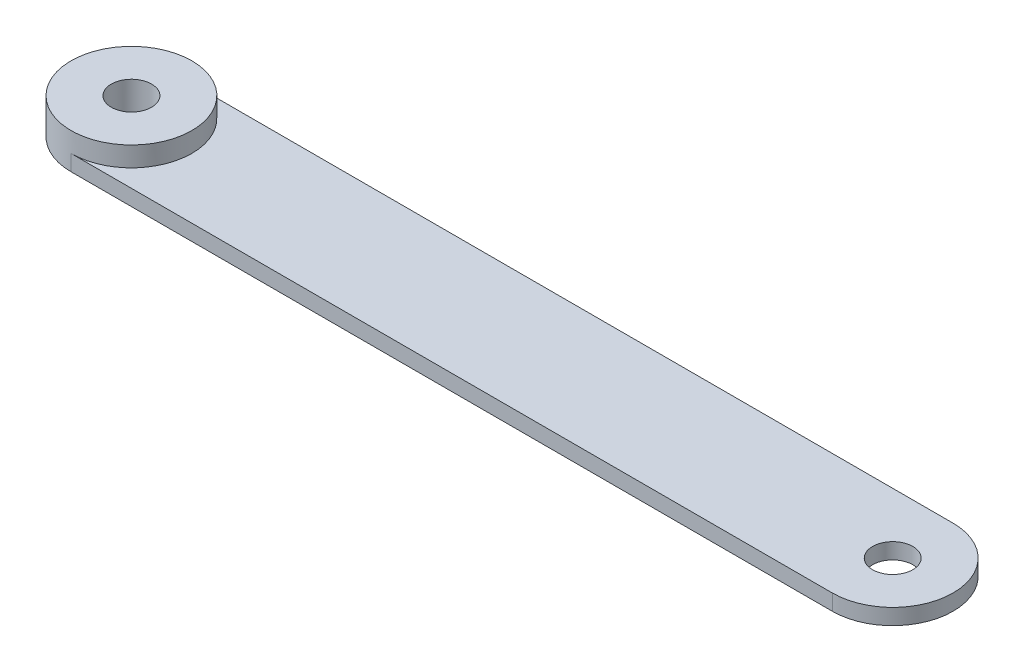
ISO-10303-21;
HEADER;
FILE_DESCRIPTION(('STEP AP214'),'2;1');
FILE_NAME('part.step','',(''),(''),'','','');
FILE_SCHEMA(('AUTOMOTIVE_DESIGN { 1 0 10303 214 1 1 1 1 }'));
ENDSEC;
DATA;
#1=APPLICATION_CONTEXT('core data for automotive mechanical design processes');
#2=APPLICATION_PROTOCOL_DEFINITION('international standard','automotive_design',2000,#1);
#3=PRODUCT_CONTEXT('',#1,'mechanical');
#4=PRODUCT('Part','Part','',(#3));
#5=PRODUCT_RELATED_PRODUCT_CATEGORY('part','',(#4));
#6=PRODUCT_DEFINITION_FORMATION('','',#4);
#7=PRODUCT_DEFINITION_CONTEXT('part definition',#1,'design');
#8=PRODUCT_DEFINITION('design','',#6,#7);
#9=PRODUCT_DEFINITION_SHAPE('','',#8);
#10=(LENGTH_UNIT() NAMED_UNIT(*) SI_UNIT(.MILLI.,.METRE.));
#11=(NAMED_UNIT(*) PLANE_ANGLE_UNIT() SI_UNIT($,.RADIAN.));
#12=(NAMED_UNIT(*) SI_UNIT($,.STERADIAN.) SOLID_ANGLE_UNIT());
#13=UNCERTAINTY_MEASURE_WITH_UNIT(LENGTH_MEASURE(1.E-05),#10,'distance_accuracy_value','');
#14=(GEOMETRIC_REPRESENTATION_CONTEXT(3) GLOBAL_UNCERTAINTY_ASSIGNED_CONTEXT((#13)) GLOBAL_UNIT_ASSIGNED_CONTEXT((#10,
#11,#12)) REPRESENTATION_CONTEXT('',''));
#15=CARTESIAN_POINT('',(0.,0.,0.));
#16=DIRECTION('',(0.,0.,1.));
#17=DIRECTION('',(1.,0.,0.));
#18=AXIS2_PLACEMENT_3D('',#15,#16,#17);
#19=CARTESIAN_POINT('',(0.,3.175,0.));
#20=DIRECTION('',(0.,1.,0.));
#21=DIRECTION('',(0.,0.,1.));
#22=AXIS2_PLACEMENT_3D('',#19,#20,#21);
#23=PLANE('',#22);
#24=CARTESIAN_POINT('',(152.4,3.175,0.));
#25=DIRECTION('',(0.,1.,0.));
#26=DIRECTION('',(0.,0.,1.));
#27=AXIS2_PLACEMENT_3D('',#24,#25,#26);
#28=CIRCLE('',#27,8.06450000000005);
#29=CARTESIAN_POINT('',(152.4,3.175,8.0645));
#30=VERTEX_POINT('',#29);
#31=EDGE_CURVE('E43',#30,#30,#28,.T.);
#32=ORIENTED_EDGE('',*,*,#31,.F.);
#33=EDGE_LOOP('',(#32));
#34=FACE_BOUND('',#33,.T.);
#35=CARTESIAN_POINT('',(-152.4,3.175,0.));
#36=DIRECTION('',(0.,-1.,0.));
#37=DIRECTION('',(0.,0.,-1.));
#38=AXIS2_PLACEMENT_3D('',#35,#36,#37);
#39=CIRCLE('',#38,24.1935000000003);
#40=CARTESIAN_POINT('',(-152.4,3.175,-24.1935));
#41=VERTEX_POINT('',#40);
#42=CARTESIAN_POINT('',(-152.4,3.175,24.1935));
#43=VERTEX_POINT('',#42);
#44=EDGE_CURVE('E11',#41,#43,#39,.T.);
#45=ORIENTED_EDGE('',*,*,#44,.T.);
#46=DIRECTION('',(1.,0.,0.));
#47=VECTOR('',#46,1.);
#48=CARTESIAN_POINT('',(0.,3.175,24.1935));
#49=LINE('',#48,#47);
#50=CARTESIAN_POINT('',(152.4,3.175,24.1934999999999));
#51=VERTEX_POINT('',#50);
#52=EDGE_CURVE('E92',#43,#51,#49,.T.);
#53=ORIENTED_EDGE('',*,*,#52,.T.);
#54=CARTESIAN_POINT('',(152.4,3.175,0.));
#55=DIRECTION('',(0.,1.,0.));
#56=DIRECTION('',(0.,0.,1.));
#57=AXIS2_PLACEMENT_3D('',#54,#55,#56);
#58=CIRCLE('',#57,24.1935);
#59=CARTESIAN_POINT('',(152.4,3.175,-24.1935));
#60=VERTEX_POINT('',#59);
#61=EDGE_CURVE('E113',#51,#60,#58,.T.);
#62=ORIENTED_EDGE('',*,*,#61,.T.);
#63=DIRECTION('',(-1.,0.,0.));
#64=VECTOR('',#63,1.);
#65=CARTESIAN_POINT('',(0.,3.175,-24.1935));
#66=LINE('',#65,#64);
#67=EDGE_CURVE('E93',#60,#41,#66,.T.);
#68=ORIENTED_EDGE('',*,*,#67,.T.);
#69=EDGE_LOOP('',(#45,#53,#62,#68));
#70=FACE_BOUND('',#69,.T.);
#71=ADVANCED_FACE('F34',(#34,#70),#23,.T.);
#72=CARTESIAN_POINT('',(0.,-3.175,0.));
#73=DIRECTION('',(0.,1.,0.));
#74=DIRECTION('',(0.,0.,1.));
#75=AXIS2_PLACEMENT_3D('',#72,#73,#74);
#76=PLANE('',#75);
#77=CARTESIAN_POINT('',(152.4,-3.175,0.));
#78=DIRECTION('',(0.,1.,0.));
#79=DIRECTION('',(0.,0.,1.));
#80=AXIS2_PLACEMENT_3D('',#77,#78,#79);
#81=CIRCLE('',#80,8.06450000000005);
#82=CARTESIAN_POINT('',(152.4,-3.175,8.0645));
#83=VERTEX_POINT('',#82);
#84=EDGE_CURVE('E117',#83,#83,#81,.T.);
#85=ORIENTED_EDGE('',*,*,#84,.T.);
#86=EDGE_LOOP('',(#85));
#87=FACE_BOUND('',#86,.T.);
#88=CARTESIAN_POINT('',(-152.4,-3.175,0.));
#89=DIRECTION('',(0.,1.,0.));
#90=DIRECTION('',(0.,0.,1.));
#91=AXIS2_PLACEMENT_3D('',#88,#89,#90);
#92=CIRCLE('',#91,8.06450000000005);
#93=CARTESIAN_POINT('',(-152.4,-3.175,8.06450000000005));
#94=VERTEX_POINT('',#93);
#95=EDGE_CURVE('E38',#94,#94,#92,.T.);
#96=ORIENTED_EDGE('',*,*,#95,.T.);
#97=EDGE_LOOP('',(#96));
#98=FACE_BOUND('',#97,.T.);
#99=DIRECTION('',(1.,0.,0.));
#100=VECTOR('',#99,1.);
#101=CARTESIAN_POINT('',(0.,-3.175,24.1935));
#102=LINE('',#101,#100);
#103=CARTESIAN_POINT('',(-152.4,-3.175,24.1935));
#104=VERTEX_POINT('',#103);
#105=CARTESIAN_POINT('',(152.4,-3.175,24.1934999999999));
#106=VERTEX_POINT('',#105);
#107=EDGE_CURVE('E90',#104,#106,#102,.T.);
#108=ORIENTED_EDGE('',*,*,#107,.F.);
#109=CARTESIAN_POINT('',(-152.4,-3.175,0.));
#110=DIRECTION('',(0.,1.,0.));
#111=DIRECTION('',(0.,0.,1.));
#112=AXIS2_PLACEMENT_3D('',#109,#110,#111);
#113=CIRCLE('',#112,24.1935);
#114=CARTESIAN_POINT('',(-152.4,-3.175,-24.1935));
#115=VERTEX_POINT('',#114);
#116=EDGE_CURVE('E77',#115,#104,#113,.T.);
#117=ORIENTED_EDGE('',*,*,#116,.F.);
#118=DIRECTION('',(-1.,0.,0.));
#119=VECTOR('',#118,1.);
#120=CARTESIAN_POINT('',(0.,-3.175,-24.1935));
#121=LINE('',#120,#119);
#122=CARTESIAN_POINT('',(152.4,-3.175,-24.1935));
#123=VERTEX_POINT('',#122);
#124=EDGE_CURVE('E102',#123,#115,#121,.T.);
#125=ORIENTED_EDGE('',*,*,#124,.F.);
#126=CARTESIAN_POINT('',(152.4,-3.175,0.));
#127=DIRECTION('',(0.,1.,0.));
#128=DIRECTION('',(0.,0.,1.));
#129=AXIS2_PLACEMENT_3D('',#126,#127,#128);
#130=CIRCLE('',#129,24.1935);
#131=EDGE_CURVE('E51',#106,#123,#130,.T.);
#132=ORIENTED_EDGE('',*,*,#131,.F.);
#133=EDGE_LOOP('',(#108,#117,#125,#132));
#134=FACE_BOUND('',#133,.T.);
#135=ADVANCED_FACE('F96',(#87,#98,#134),#76,.F.);
#136=CARTESIAN_POINT('',(-152.4,3.175,0.));
#137=DIRECTION('',(0.,-1.,0.));
#138=DIRECTION('',(0.,0.,-1.));
#139=AXIS2_PLACEMENT_3D('',#136,#137,#138);
#140=CYLINDRICAL_SURFACE('',#139,24.1935);
#141=DIRECTION('',(0.,1.,0.));
#142=VECTOR('',#141,1.);
#143=CARTESIAN_POINT('',(-152.4,-3.175,24.1935));
#144=LINE('',#143,#142);
#145=EDGE_CURVE('E81',#104,#43,#144,.T.);
#146=ORIENTED_EDGE('',*,*,#145,.T.);
#147=ORIENTED_EDGE('',*,*,#44,.F.);
#148=DIRECTION('',(0.,1.,0.));
#149=VECTOR('',#148,1.);
#150=CARTESIAN_POINT('',(-152.4,-3.175,-24.1935));
#151=LINE('',#150,#149);
#152=EDGE_CURVE('E82',#115,#41,#151,.T.);
#153=ORIENTED_EDGE('',*,*,#152,.F.);
#154=ORIENTED_EDGE('',*,*,#116,.T.);
#155=EDGE_LOOP('',(#146,#147,#153,#154));
#156=FACE_BOUND('',#155,.T.);
#157=CARTESIAN_POINT('',(-152.4,11.1125,0.));
#158=DIRECTION('',(0.,-1.,0.));
#159=DIRECTION('',(0.,0.,-1.));
#160=AXIS2_PLACEMENT_3D('',#157,#158,#159);
#161=CIRCLE('',#160,24.1935000000003);
#162=CARTESIAN_POINT('',(-152.4,11.1125,-24.1935000000003));
#163=VERTEX_POINT('',#162);
#164=EDGE_CURVE('E84',#163,#163,#161,.T.);
#165=ORIENTED_EDGE('',*,*,#164,.T.);
#166=EDGE_LOOP('',(#165));
#167=FACE_BOUND('',#166,.T.);
#168=ADVANCED_FACE('F36',(#156,#167),#140,.T.);
#169=CARTESIAN_POINT('',(152.4,3.175,0.));
#170=DIRECTION('',(0.,-1.,0.));
#171=DIRECTION('',(0.,0.,-1.));
#172=AXIS2_PLACEMENT_3D('',#169,#170,#171);
#173=CYLINDRICAL_SURFACE('',#172,8.06450000000005);
#174=ORIENTED_EDGE('',*,*,#31,.T.);
#175=EDGE_LOOP('',(#174));
#176=FACE_BOUND('',#175,.T.);
#177=ORIENTED_EDGE('',*,*,#84,.F.);
#178=EDGE_LOOP('',(#177));
#179=FACE_BOUND('',#178,.T.);
#180=ADVANCED_FACE('F139',(#176,#179),#173,.F.);
#181=CARTESIAN_POINT('',(152.4,3.175,0.));
#182=DIRECTION('',(0.,-1.,0.));
#183=DIRECTION('',(0.,0.,-1.));
#184=AXIS2_PLACEMENT_3D('',#181,#182,#183);
#185=CYLINDRICAL_SURFACE('',#184,24.1935);
#186=ORIENTED_EDGE('',*,*,#131,.T.);
#187=DIRECTION('',(0.,1.,0.));
#188=VECTOR('',#187,1.);
#189=CARTESIAN_POINT('',(152.4,-3.175,-24.1935));
#190=LINE('',#189,#188);
#191=EDGE_CURVE('E97',#123,#60,#190,.T.);
#192=ORIENTED_EDGE('',*,*,#191,.T.);
#193=ORIENTED_EDGE('',*,*,#61,.F.);
#194=DIRECTION('',(0.,1.,0.));
#195=VECTOR('',#194,1.);
#196=CARTESIAN_POINT('',(152.4,-3.175,24.1934999999999));
#197=LINE('',#196,#195);
#198=EDGE_CURVE('E94',#106,#51,#197,.T.);
#199=ORIENTED_EDGE('',*,*,#198,.F.);
#200=EDGE_LOOP('',(#186,#192,#193,#199));
#201=FACE_BOUND('',#200,.T.);
#202=ADVANCED_FACE('F129',(#201),#185,.T.);
#203=CARTESIAN_POINT('',(-152.4,3.175,0.));
#204=DIRECTION('',(0.,-1.,0.));
#205=DIRECTION('',(0.,0.,-1.));
#206=AXIS2_PLACEMENT_3D('',#203,#204,#205);
#207=CYLINDRICAL_SURFACE('',#206,8.06450000000005);
#208=ORIENTED_EDGE('',*,*,#95,.F.);
#209=EDGE_LOOP('',(#208));
#210=FACE_BOUND('',#209,.T.);
#211=CARTESIAN_POINT('',(-152.4,11.1125,0.));
#212=DIRECTION('',(0.,-1.,0.));
#213=DIRECTION('',(0.,0.,-1.));
#214=AXIS2_PLACEMENT_3D('',#211,#212,#213);
#215=CIRCLE('',#214,8.06450000000005);
#216=CARTESIAN_POINT('',(-152.4,11.1125,-8.06450000000005));
#217=VERTEX_POINT('',#216);
#218=EDGE_CURVE('E108',#217,#217,#215,.T.);
#219=ORIENTED_EDGE('',*,*,#218,.F.);
#220=EDGE_LOOP('',(#219));
#221=FACE_BOUND('',#220,.T.);
#222=ADVANCED_FACE('F125',(#210,#221),#207,.F.);
#223=CARTESIAN_POINT('',(-152.4,11.1125,0.));
#224=DIRECTION('',(0.,-1.,0.));
#225=DIRECTION('',(0.,0.,-1.));
#226=AXIS2_PLACEMENT_3D('',#223,#224,#225);
#227=PLANE('',#226);
#228=ORIENTED_EDGE('',*,*,#218,.T.);
#229=EDGE_LOOP('',(#228));
#230=FACE_BOUND('',#229,.T.);
#231=ORIENTED_EDGE('',*,*,#164,.F.);
#232=EDGE_LOOP('',(#231));
#233=FACE_BOUND('',#232,.T.);
#234=ADVANCED_FACE('F128',(#230,#233),#227,.F.);
#235=CARTESIAN_POINT('',(0.,-3.175,-24.1935));
#236=DIRECTION('',(0.,0.,-1.));
#237=DIRECTION('',(-1.,0.,0.));
#238=AXIS2_PLACEMENT_3D('',#235,#236,#237);
#239=PLANE('',#238);
#240=ORIENTED_EDGE('',*,*,#191,.F.);
#241=ORIENTED_EDGE('',*,*,#124,.T.);
#242=ORIENTED_EDGE('',*,*,#152,.T.);
#243=ORIENTED_EDGE('',*,*,#67,.F.);
#244=EDGE_LOOP('',(#240,#241,#242,#243));
#245=FACE_BOUND('',#244,.T.);
#246=ADVANCED_FACE('F135',(#245),#239,.T.);
#247=CARTESIAN_POINT('',(0.,-3.175,24.1935));
#248=DIRECTION('',(0.,0.,1.));
#249=DIRECTION('',(1.,0.,0.));
#250=AXIS2_PLACEMENT_3D('',#247,#248,#249);
#251=PLANE('',#250);
#252=ORIENTED_EDGE('',*,*,#145,.F.);
#253=ORIENTED_EDGE('',*,*,#107,.T.);
#254=ORIENTED_EDGE('',*,*,#198,.T.);
#255=ORIENTED_EDGE('',*,*,#52,.F.);
#256=EDGE_LOOP('',(#252,#253,#254,#255));
#257=FACE_BOUND('',#256,.T.);
#258=ADVANCED_FACE('F88',(#257),#251,.T.);
#259=CLOSED_SHELL('',(#71,#135,#168,#180,#202,#222,#234,#246,#258));
#260=MANIFOLD_SOLID_BREP('B2',#259);
#261=ADVANCED_BREP_SHAPE_REPRESENTATION('',(#18,#260),#14);
#262=SHAPE_DEFINITION_REPRESENTATION(#9,#261);
ENDSEC;
END-ISO-10303-21;
